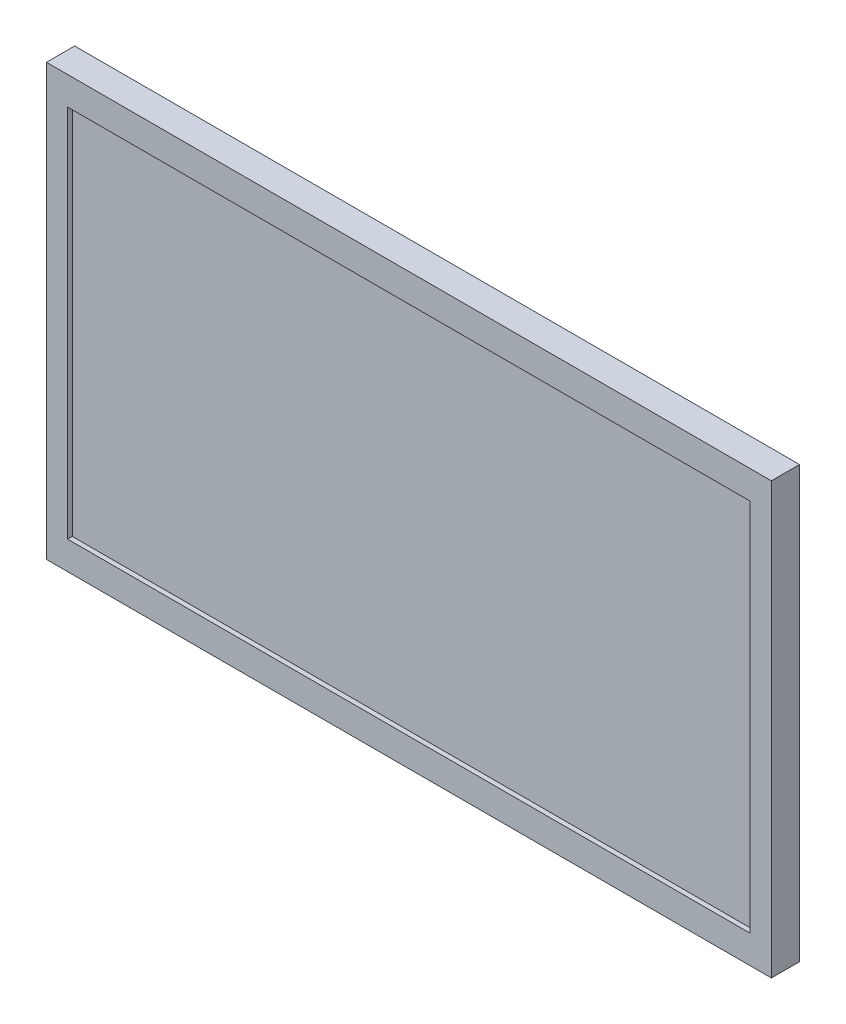
ISO-10303-21;
HEADER;
FILE_DESCRIPTION(('STEP AP214'),'2;1');
FILE_NAME('part.step','',(''),(''),'','','');
FILE_SCHEMA(('AUTOMOTIVE_DESIGN { 1 0 10303 214 1 1 1 1 }'));
ENDSEC;
DATA;
#1=APPLICATION_CONTEXT('core data for automotive mechanical design processes');
#2=APPLICATION_PROTOCOL_DEFINITION('international standard','automotive_design',2000,#1);
#3=PRODUCT_CONTEXT('',#1,'mechanical');
#4=PRODUCT('Part','Part','',(#3));
#5=PRODUCT_RELATED_PRODUCT_CATEGORY('part','',(#4));
#6=PRODUCT_DEFINITION_FORMATION('','',#4);
#7=PRODUCT_DEFINITION_CONTEXT('part definition',#1,'design');
#8=PRODUCT_DEFINITION('design','',#6,#7);
#9=PRODUCT_DEFINITION_SHAPE('','',#8);
#10=(LENGTH_UNIT() NAMED_UNIT(*) SI_UNIT(.MILLI.,.METRE.));
#11=(NAMED_UNIT(*) PLANE_ANGLE_UNIT() SI_UNIT($,.RADIAN.));
#12=(NAMED_UNIT(*) SI_UNIT($,.STERADIAN.) SOLID_ANGLE_UNIT());
#13=UNCERTAINTY_MEASURE_WITH_UNIT(LENGTH_MEASURE(1.E-05),#10,'distance_accuracy_value','');
#14=(GEOMETRIC_REPRESENTATION_CONTEXT(3) GLOBAL_UNCERTAINTY_ASSIGNED_CONTEXT((#13)) GLOBAL_UNIT_ASSIGNED_CONTEXT((#10,
#11,#12)) REPRESENTATION_CONTEXT('',''));
#15=CARTESIAN_POINT('',(0.,0.,0.));
#16=DIRECTION('',(0.,0.,1.));
#17=DIRECTION('',(1.,0.,0.));
#18=AXIS2_PLACEMENT_3D('',#15,#16,#17);
#19=CARTESIAN_POINT('',(0.,0.,15.));
#20=DIRECTION('',(0.,0.,-1.));
#21=DIRECTION('',(-1.,0.,0.));
#22=AXIS2_PLACEMENT_3D('',#19,#20,#21);
#23=PLANE('',#22);
#24=DIRECTION('',(0.,1.,0.));
#25=VECTOR('',#24,1.);
#26=CARTESIAN_POINT('',(218.,-119.5,15.));
#27=LINE('',#26,#25);
#28=CARTESIAN_POINT('',(218.,-119.5,15.));
#29=VERTEX_POINT('',#28);
#30=CARTESIAN_POINT('',(218.,119.5,15.));
#31=VERTEX_POINT('',#30);
#32=EDGE_CURVE('E80',#29,#31,#27,.T.);
#33=ORIENTED_EDGE('',*,*,#32,.T.);
#34=DIRECTION('',(1.,0.,0.));
#35=VECTOR('',#34,1.);
#36=CARTESIAN_POINT('',(-218.,119.5,15.));
#37=LINE('',#36,#35);
#38=CARTESIAN_POINT('',(-218.,119.5,15.));
#39=VERTEX_POINT('',#38);
#40=EDGE_CURVE('E95',#31,#39,#37,.F.);
#41=ORIENTED_EDGE('',*,*,#40,.T.);
#42=DIRECTION('',(0.,1.,0.));
#43=VECTOR('',#42,1.);
#44=CARTESIAN_POINT('',(-218.,-119.5,15.));
#45=LINE('',#44,#43);
#46=CARTESIAN_POINT('',(-218.,-119.5,15.));
#47=VERTEX_POINT('',#46);
#48=EDGE_CURVE('E85',#39,#47,#45,.F.);
#49=ORIENTED_EDGE('',*,*,#48,.T.);
#50=DIRECTION('',(1.,0.,0.));
#51=VECTOR('',#50,1.);
#52=CARTESIAN_POINT('',(-218.,-119.5,15.));
#53=LINE('',#52,#51);
#54=EDGE_CURVE('E20',#47,#29,#53,.T.);
#55=ORIENTED_EDGE('',*,*,#54,.T.);
#56=EDGE_LOOP('',(#33,#41,#49,#55));
#57=FACE_BOUND('',#56,.T.);
#58=ADVANCED_FACE('F17',(#57),#23,.F.);
#59=CARTESIAN_POINT('',(-218.,-119.5,15.));
#60=DIRECTION('',(0.,-1.,0.));
#61=DIRECTION('',(0.,0.,-1.));
#62=AXIS2_PLACEMENT_3D('',#59,#60,#61);
#63=PLANE('',#62);
#64=DIRECTION('',(-1.,0.,0.));
#65=VECTOR('',#64,1.);
#66=CARTESIAN_POINT('',(0.,-119.5,18.));
#67=LINE('',#66,#65);
#68=CARTESIAN_POINT('',(-218.,-119.5,18.));
#69=VERTEX_POINT('',#68);
#70=CARTESIAN_POINT('',(218.,-119.5,18.));
#71=VERTEX_POINT('',#70);
#72=EDGE_CURVE('E92',#69,#71,#67,.F.);
#73=ORIENTED_EDGE('',*,*,#72,.T.);
#74=DIRECTION('',(0.,0.,-1.));
#75=VECTOR('',#74,1.);
#76=CARTESIAN_POINT('',(218.,-119.5,15.));
#77=LINE('',#76,#75);
#78=EDGE_CURVE('E89',#71,#29,#77,.T.);
#79=ORIENTED_EDGE('',*,*,#78,.T.);
#80=ORIENTED_EDGE('',*,*,#54,.F.);
#81=DIRECTION('',(0.,0.,1.));
#82=VECTOR('',#81,1.);
#83=CARTESIAN_POINT('',(-218.,-119.5,15.));
#84=LINE('',#83,#82);
#85=EDGE_CURVE('E105',#47,#69,#84,.T.);
#86=ORIENTED_EDGE('',*,*,#85,.T.);
#87=EDGE_LOOP('',(#73,#79,#80,#86));
#88=FACE_BOUND('',#87,.T.);
#89=ADVANCED_FACE('F90',(#88),#63,.F.);
#90=CARTESIAN_POINT('',(218.,-119.5,15.));
#91=DIRECTION('',(1.,0.,0.));
#92=DIRECTION('',(0.,0.,-1.));
#93=AXIS2_PLACEMENT_3D('',#90,#91,#92);
#94=PLANE('',#93);
#95=DIRECTION('',(0.,1.,0.));
#96=VECTOR('',#95,1.);
#97=CARTESIAN_POINT('',(218.,0.,18.));
#98=LINE('',#97,#96);
#99=CARTESIAN_POINT('',(218.,119.5,18.));
#100=VERTEX_POINT('',#99);
#101=EDGE_CURVE('E111',#71,#100,#98,.T.);
#102=ORIENTED_EDGE('',*,*,#101,.T.);
#103=DIRECTION('',(0.,0.,1.));
#104=VECTOR('',#103,1.);
#105=CARTESIAN_POINT('',(218.,119.5,15.));
#106=LINE('',#105,#104);
#107=EDGE_CURVE('E99',#100,#31,#106,.F.);
#108=ORIENTED_EDGE('',*,*,#107,.T.);
#109=ORIENTED_EDGE('',*,*,#32,.F.);
#110=ORIENTED_EDGE('',*,*,#78,.F.);
#111=EDGE_LOOP('',(#102,#108,#109,#110));
#112=FACE_BOUND('',#111,.T.);
#113=ADVANCED_FACE('F97',(#112),#94,.F.);
#114=CARTESIAN_POINT('',(-218.,119.5,15.));
#115=DIRECTION('',(0.,1.,0.));
#116=DIRECTION('',(0.,0.,1.));
#117=AXIS2_PLACEMENT_3D('',#114,#115,#116);
#118=PLANE('',#117);
#119=DIRECTION('',(-1.,0.,0.));
#120=VECTOR('',#119,1.);
#121=CARTESIAN_POINT('',(0.,119.5,18.));
#122=LINE('',#121,#120);
#123=CARTESIAN_POINT('',(-218.,119.5,18.));
#124=VERTEX_POINT('',#123);
#125=EDGE_CURVE('E113',#100,#124,#122,.T.);
#126=ORIENTED_EDGE('',*,*,#125,.T.);
#127=DIRECTION('',(0.,0.,1.));
#128=VECTOR('',#127,1.);
#129=CARTESIAN_POINT('',(-218.,119.5,15.));
#130=LINE('',#129,#128);
#131=EDGE_CURVE('E107',#124,#39,#130,.F.);
#132=ORIENTED_EDGE('',*,*,#131,.T.);
#133=ORIENTED_EDGE('',*,*,#40,.F.);
#134=ORIENTED_EDGE('',*,*,#107,.F.);
#135=EDGE_LOOP('',(#126,#132,#133,#134));
#136=FACE_BOUND('',#135,.T.);
#137=ADVANCED_FACE('F179',(#136),#118,.F.);
#138=CARTESIAN_POINT('',(-218.,-119.5,15.));
#139=DIRECTION('',(-1.,0.,0.));
#140=DIRECTION('',(0.,0.,1.));
#141=AXIS2_PLACEMENT_3D('',#138,#139,#140);
#142=PLANE('',#141);
#143=DIRECTION('',(0.,1.,0.));
#144=VECTOR('',#143,1.);
#145=CARTESIAN_POINT('',(-218.,0.,18.));
#146=LINE('',#145,#144);
#147=EDGE_CURVE('E115',#124,#69,#146,.F.);
#148=ORIENTED_EDGE('',*,*,#147,.T.);
#149=ORIENTED_EDGE('',*,*,#85,.F.);
#150=ORIENTED_EDGE('',*,*,#48,.F.);
#151=ORIENTED_EDGE('',*,*,#131,.F.);
#152=EDGE_LOOP('',(#148,#149,#150,#151));
#153=FACE_BOUND('',#152,.T.);
#154=ADVANCED_FACE('F175',(#153),#142,.F.);
#155=CARTESIAN_POINT('',(0.,0.,18.));
#156=DIRECTION('',(0.,0.,-1.));
#157=DIRECTION('',(-1.,0.,0.));
#158=AXIS2_PLACEMENT_3D('',#155,#156,#157);
#159=PLANE('',#158);
#160=ORIENTED_EDGE('',*,*,#125,.F.);
#161=ORIENTED_EDGE('',*,*,#101,.F.);
#162=ORIENTED_EDGE('',*,*,#72,.F.);
#163=ORIENTED_EDGE('',*,*,#147,.F.);
#164=EDGE_LOOP('',(#160,#161,#162,#163));
#165=FACE_BOUND('',#164,.T.);
#166=DIRECTION('',(0.,1.,0.));
#167=VECTOR('',#166,1.);
#168=CARTESIAN_POINT('',(231.5,-137.5,18.));
#169=LINE('',#168,#167);
#170=CARTESIAN_POINT('',(231.5,-137.5,18.));
#171=VERTEX_POINT('',#170);
#172=CARTESIAN_POINT('',(231.5,137.5,18.));
#173=VERTEX_POINT('',#172);
#174=EDGE_CURVE('E124',#171,#173,#169,.T.);
#175=ORIENTED_EDGE('',*,*,#174,.T.);
#176=DIRECTION('',(1.,0.,0.));
#177=VECTOR('',#176,1.);
#178=CARTESIAN_POINT('',(-231.5,137.5,18.));
#179=LINE('',#178,#177);
#180=CARTESIAN_POINT('',(-231.5,137.5,18.));
#181=VERTEX_POINT('',#180);
#182=EDGE_CURVE('E120',#173,#181,#179,.F.);
#183=ORIENTED_EDGE('',*,*,#182,.T.);
#184=DIRECTION('',(0.,1.,0.));
#185=VECTOR('',#184,1.);
#186=CARTESIAN_POINT('',(-231.5,-137.5,18.));
#187=LINE('',#186,#185);
#188=CARTESIAN_POINT('',(-231.5,-137.5,18.));
#189=VERTEX_POINT('',#188);
#190=EDGE_CURVE('E118',#181,#189,#187,.F.);
#191=ORIENTED_EDGE('',*,*,#190,.T.);
#192=DIRECTION('',(1.,0.,0.));
#193=VECTOR('',#192,1.);
#194=CARTESIAN_POINT('',(-231.5,-137.5,18.));
#195=LINE('',#194,#193);
#196=EDGE_CURVE('E128',#189,#171,#195,.T.);
#197=ORIENTED_EDGE('',*,*,#196,.T.);
#198=EDGE_LOOP('',(#175,#183,#191,#197));
#199=FACE_BOUND('',#198,.T.);
#200=ADVANCED_FACE('F152',(#165,#199),#159,.F.);
#201=CARTESIAN_POINT('',(-231.5,-137.5,18.));
#202=DIRECTION('',(1.,0.,0.));
#203=DIRECTION('',(0.,0.,-1.));
#204=AXIS2_PLACEMENT_3D('',#201,#202,#203);
#205=PLANE('',#204);
#206=DIRECTION('',(0.,1.,0.));
#207=VECTOR('',#206,1.);
#208=CARTESIAN_POINT('',(-231.5,0.,0.));
#209=LINE('',#208,#207);
#210=CARTESIAN_POINT('',(-231.5,-137.5,0.));
#211=VERTEX_POINT('',#210);
#212=CARTESIAN_POINT('',(-231.5,137.5,0.));
#213=VERTEX_POINT('',#212);
#214=EDGE_CURVE('E134',#211,#213,#209,.T.);
#215=ORIENTED_EDGE('',*,*,#214,.F.);
#216=DIRECTION('',(0.,0.,1.));
#217=VECTOR('',#216,1.);
#218=CARTESIAN_POINT('',(-231.5,-137.5,18.));
#219=LINE('',#218,#217);
#220=EDGE_CURVE('E131',#211,#189,#219,.T.);
#221=ORIENTED_EDGE('',*,*,#220,.T.);
#222=ORIENTED_EDGE('',*,*,#190,.F.);
#223=DIRECTION('',(0.,0.,-1.));
#224=VECTOR('',#223,1.);
#225=CARTESIAN_POINT('',(-231.5,137.5,18.));
#226=LINE('',#225,#224);
#227=EDGE_CURVE('E122',#181,#213,#226,.T.);
#228=ORIENTED_EDGE('',*,*,#227,.T.);
#229=EDGE_LOOP('',(#215,#221,#222,#228));
#230=FACE_BOUND('',#229,.T.);
#231=ADVANCED_FACE('F154',(#230),#205,.F.);
#232=CARTESIAN_POINT('',(-231.5,137.5,18.));
#233=DIRECTION('',(0.,-1.,0.));
#234=DIRECTION('',(0.,0.,-1.));
#235=AXIS2_PLACEMENT_3D('',#232,#233,#234);
#236=PLANE('',#235);
#237=DIRECTION('',(-1.,0.,0.));
#238=VECTOR('',#237,1.);
#239=CARTESIAN_POINT('',(0.,137.5,0.));
#240=LINE('',#239,#238);
#241=CARTESIAN_POINT('',(231.5,137.5,0.));
#242=VERTEX_POINT('',#241);
#243=EDGE_CURVE('E137',#213,#242,#240,.F.);
#244=ORIENTED_EDGE('',*,*,#243,.F.);
#245=ORIENTED_EDGE('',*,*,#227,.F.);
#246=ORIENTED_EDGE('',*,*,#182,.F.);
#247=DIRECTION('',(0.,0.,1.));
#248=VECTOR('',#247,1.);
#249=CARTESIAN_POINT('',(231.5,137.5,18.));
#250=LINE('',#249,#248);
#251=EDGE_CURVE('E126',#173,#242,#250,.F.);
#252=ORIENTED_EDGE('',*,*,#251,.T.);
#253=EDGE_LOOP('',(#244,#245,#246,#252));
#254=FACE_BOUND('',#253,.T.);
#255=ADVANCED_FACE('F148',(#254),#236,.F.);
#256=CARTESIAN_POINT('',(231.5,-137.5,18.));
#257=DIRECTION('',(-1.,0.,0.));
#258=DIRECTION('',(0.,0.,1.));
#259=AXIS2_PLACEMENT_3D('',#256,#257,#258);
#260=PLANE('',#259);
#261=DIRECTION('',(0.,1.,0.));
#262=VECTOR('',#261,1.);
#263=CARTESIAN_POINT('',(231.5,0.,0.));
#264=LINE('',#263,#262);
#265=CARTESIAN_POINT('',(231.5,-137.5,0.));
#266=VERTEX_POINT('',#265);
#267=EDGE_CURVE('E26',#242,#266,#264,.F.);
#268=ORIENTED_EDGE('',*,*,#267,.F.);
#269=ORIENTED_EDGE('',*,*,#251,.F.);
#270=ORIENTED_EDGE('',*,*,#174,.F.);
#271=DIRECTION('',(0.,0.,1.));
#272=VECTOR('',#271,1.);
#273=CARTESIAN_POINT('',(231.5,-137.5,18.));
#274=LINE('',#273,#272);
#275=EDGE_CURVE('E35',#171,#266,#274,.F.);
#276=ORIENTED_EDGE('',*,*,#275,.T.);
#277=EDGE_LOOP('',(#268,#269,#270,#276));
#278=FACE_BOUND('',#277,.T.);
#279=ADVANCED_FACE('F145',(#278),#260,.F.);
#280=CARTESIAN_POINT('',(-231.5,-137.5,18.));
#281=DIRECTION('',(0.,1.,0.));
#282=DIRECTION('',(0.,0.,1.));
#283=AXIS2_PLACEMENT_3D('',#280,#281,#282);
#284=PLANE('',#283);
#285=DIRECTION('',(-1.,0.,0.));
#286=VECTOR('',#285,1.);
#287=CARTESIAN_POINT('',(0.,-137.5,0.));
#288=LINE('',#287,#286);
#289=EDGE_CURVE('E11',#266,#211,#288,.T.);
#290=ORIENTED_EDGE('',*,*,#289,.F.);
#291=ORIENTED_EDGE('',*,*,#275,.F.);
#292=ORIENTED_EDGE('',*,*,#196,.F.);
#293=ORIENTED_EDGE('',*,*,#220,.F.);
#294=EDGE_LOOP('',(#290,#291,#292,#293));
#295=FACE_BOUND('',#294,.T.);
#296=ADVANCED_FACE('F158',(#295),#284,.F.);
#297=CARTESIAN_POINT('',(0.,0.,0.));
#298=DIRECTION('',(0.,0.,-1.));
#299=DIRECTION('',(-1.,0.,0.));
#300=AXIS2_PLACEMENT_3D('',#297,#298,#299);
#301=PLANE('',#300);
#302=ORIENTED_EDGE('',*,*,#267,.T.);
#303=ORIENTED_EDGE('',*,*,#289,.T.);
#304=ORIENTED_EDGE('',*,*,#214,.T.);
#305=ORIENTED_EDGE('',*,*,#243,.T.);
#306=EDGE_LOOP('',(#302,#303,#304,#305));
#307=FACE_BOUND('',#306,.T.);
#308=ADVANCED_FACE('F142',(#307),#301,.T.);
#309=CLOSED_SHELL('',(#58,#89,#113,#137,#154,#200,#231,#255,#279,#296,#308));
#310=MANIFOLD_SOLID_BREP('B1',#309);
#311=ADVANCED_BREP_SHAPE_REPRESENTATION('',(#18,#310),#14);
#312=SHAPE_DEFINITION_REPRESENTATION(#9,#311);
ENDSEC;
END-ISO-10303-21;
